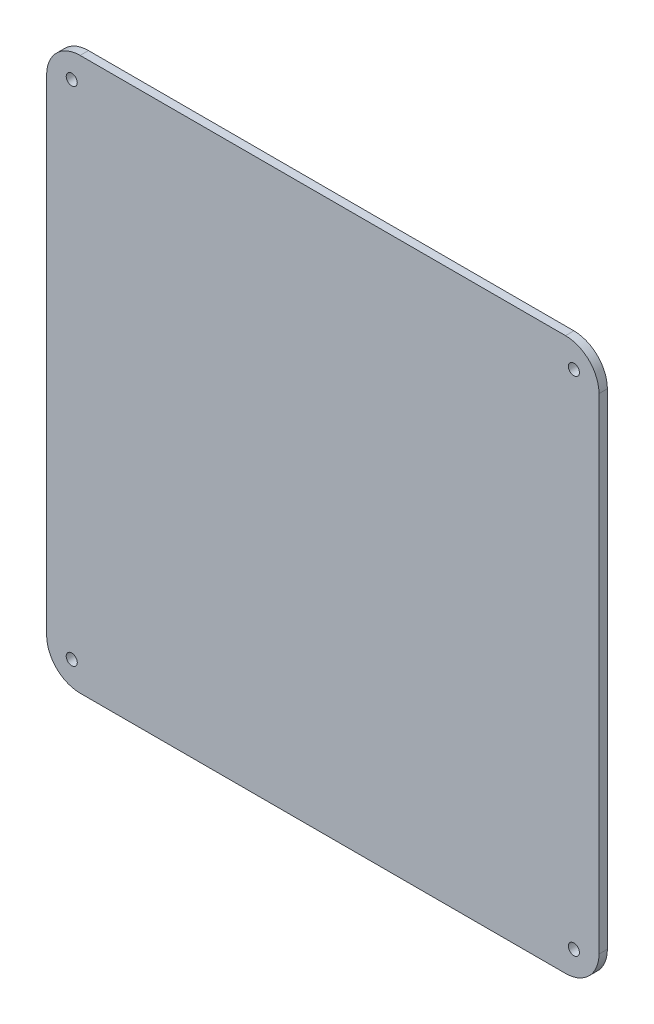
ISO-10303-21;
HEADER;
FILE_DESCRIPTION(('STEP AP214'),'2;1');
FILE_NAME('part.step','',(''),(''),'','','');
FILE_SCHEMA(('AUTOMOTIVE_DESIGN { 1 0 10303 214 1 1 1 1 }'));
ENDSEC;
DATA;
#1=APPLICATION_CONTEXT('core data for automotive mechanical design processes');
#2=APPLICATION_PROTOCOL_DEFINITION('international standard','automotive_design',2000,#1);
#3=PRODUCT_CONTEXT('',#1,'mechanical');
#4=PRODUCT('Part','Part','',(#3));
#5=PRODUCT_RELATED_PRODUCT_CATEGORY('part','',(#4));
#6=PRODUCT_DEFINITION_FORMATION('','',#4);
#7=PRODUCT_DEFINITION_CONTEXT('part definition',#1,'design');
#8=PRODUCT_DEFINITION('design','',#6,#7);
#9=PRODUCT_DEFINITION_SHAPE('','',#8);
#10=(LENGTH_UNIT() NAMED_UNIT(*) SI_UNIT(.MILLI.,.METRE.));
#11=(NAMED_UNIT(*) PLANE_ANGLE_UNIT() SI_UNIT($,.RADIAN.));
#12=(NAMED_UNIT(*) SI_UNIT($,.STERADIAN.) SOLID_ANGLE_UNIT());
#13=UNCERTAINTY_MEASURE_WITH_UNIT(LENGTH_MEASURE(1.E-05),#10,'distance_accuracy_value','');
#14=(GEOMETRIC_REPRESENTATION_CONTEXT(3) GLOBAL_UNCERTAINTY_ASSIGNED_CONTEXT((#13)) GLOBAL_UNIT_ASSIGNED_CONTEXT((#10,
#11,#12)) REPRESENTATION_CONTEXT('',''));
#15=CARTESIAN_POINT('',(0.,0.,0.));
#16=DIRECTION('',(0.,0.,1.));
#17=DIRECTION('',(1.,0.,0.));
#18=AXIS2_PLACEMENT_3D('',#15,#16,#17);
#19=CARTESIAN_POINT('',(-43.1287523486234,308.942488789238,5.));
#20=DIRECTION('',(1.,0.,0.));
#21=DIRECTION('',(0.,1.,0.));
#22=AXIS2_PLACEMENT_3D('',#19,#20,#21);
#23=PLANE('',#22);
#24=DIRECTION('',(0.,-1.,0.));
#25=VECTOR('',#24,1.);
#26=CARTESIAN_POINT('',(-43.1287523486234,308.942488789238,0.));
#27=LINE('',#26,#25);
#28=CARTESIAN_POINT('',(-43.1287523486234,288.942488789238,0.));
#29=VERTEX_POINT('',#28);
#30=CARTESIAN_POINT('',(-43.1287523486234,-1.05751121076236,0.));
#31=VERTEX_POINT('',#30);
#32=EDGE_CURVE('E184',#29,#31,#27,.T.);
#33=ORIENTED_EDGE('',*,*,#32,.T.);
#34=DIRECTION('',(0.,0.,-1.));
#35=VECTOR('',#34,1.);
#36=CARTESIAN_POINT('',(-43.1287523486234,-1.05751121076236,5.));
#37=LINE('',#36,#35);
#38=CARTESIAN_POINT('',(-43.1287523486234,-1.05751121076236,5.));
#39=VERTEX_POINT('',#38);
#40=EDGE_CURVE('E11',#31,#39,#37,.F.);
#41=ORIENTED_EDGE('',*,*,#40,.T.);
#42=DIRECTION('',(0.,-1.,0.));
#43=VECTOR('',#42,1.);
#44=CARTESIAN_POINT('',(-43.1287523486234,308.942488789238,5.));
#45=LINE('',#44,#43);
#46=CARTESIAN_POINT('',(-43.1287523486234,288.942488789238,5.));
#47=VERTEX_POINT('',#46);
#48=EDGE_CURVE('E136',#47,#39,#45,.T.);
#49=ORIENTED_EDGE('',*,*,#48,.F.);
#50=DIRECTION('',(0.,0.,-1.));
#51=VECTOR('',#50,1.);
#52=CARTESIAN_POINT('',(-43.1287523486234,288.942488789238,5.));
#53=LINE('',#52,#51);
#54=EDGE_CURVE('E49',#47,#29,#53,.T.);
#55=ORIENTED_EDGE('',*,*,#54,.T.);
#56=EDGE_LOOP('',(#33,#41,#49,#55));
#57=FACE_BOUND('',#56,.T.);
#58=ADVANCED_FACE('F40',(#57),#23,.F.);
#59=CARTESIAN_POINT('',(-43.1287523486234,-21.0575112107623,5.));
#60=DIRECTION('',(0.,1.,0.));
#61=DIRECTION('',(0.,0.,1.));
#62=AXIS2_PLACEMENT_3D('',#59,#60,#61);
#63=PLANE('',#62);
#64=DIRECTION('',(1.,0.,0.));
#65=VECTOR('',#64,1.);
#66=CARTESIAN_POINT('',(-43.1287523486234,-21.0575112107623,0.));
#67=LINE('',#66,#65);
#68=CARTESIAN_POINT('',(-23.1287523486234,-21.0575112107623,0.));
#69=VERTEX_POINT('',#68);
#70=CARTESIAN_POINT('',(266.871247651377,-21.0575112107623,0.));
#71=VERTEX_POINT('',#70);
#72=EDGE_CURVE('E144',#69,#71,#67,.T.);
#73=ORIENTED_EDGE('',*,*,#72,.T.);
#74=DIRECTION('',(0.,0.,-1.));
#75=VECTOR('',#74,1.);
#76=CARTESIAN_POINT('',(266.871247651377,-21.0575112107623,5.));
#77=LINE('',#76,#75);
#78=CARTESIAN_POINT('',(266.871247651377,-21.0575112107623,5.));
#79=VERTEX_POINT('',#78);
#80=EDGE_CURVE('E56',#71,#79,#77,.F.);
#81=ORIENTED_EDGE('',*,*,#80,.T.);
#82=DIRECTION('',(1.,0.,0.));
#83=VECTOR('',#82,1.);
#84=CARTESIAN_POINT('',(-43.1287523486234,-21.0575112107623,5.));
#85=LINE('',#84,#83);
#86=CARTESIAN_POINT('',(-23.1287523486234,-21.0575112107623,5.));
#87=VERTEX_POINT('',#86);
#88=EDGE_CURVE('E141',#87,#79,#85,.T.);
#89=ORIENTED_EDGE('',*,*,#88,.F.);
#90=DIRECTION('',(0.,0.,-1.));
#91=VECTOR('',#90,1.);
#92=CARTESIAN_POINT('',(-23.1287523486234,-21.0575112107623,5.));
#93=LINE('',#92,#91);
#94=EDGE_CURVE('E172',#87,#69,#93,.T.);
#95=ORIENTED_EDGE('',*,*,#94,.T.);
#96=EDGE_LOOP('',(#73,#81,#89,#95));
#97=FACE_BOUND('',#96,.T.);
#98=ADVANCED_FACE('F260',(#97),#63,.F.);
#99=CARTESIAN_POINT('',(286.871247651377,308.942488789238,5.));
#100=DIRECTION('',(-1.,0.,0.));
#101=DIRECTION('',(0.,-1.,0.));
#102=AXIS2_PLACEMENT_3D('',#99,#100,#101);
#103=PLANE('',#102);
#104=DIRECTION('',(0.,1.,0.));
#105=VECTOR('',#104,1.);
#106=CARTESIAN_POINT('',(286.871247651377,308.942488789238,0.));
#107=LINE('',#106,#105);
#108=CARTESIAN_POINT('',(286.871247651377,-1.05751121076236,0.));
#109=VERTEX_POINT('',#108);
#110=CARTESIAN_POINT('',(286.871247651377,288.942488789238,0.));
#111=VERTEX_POINT('',#110);
#112=EDGE_CURVE('E137',#109,#111,#107,.T.);
#113=ORIENTED_EDGE('',*,*,#112,.T.);
#114=DIRECTION('',(0.,0.,-1.));
#115=VECTOR('',#114,1.);
#116=CARTESIAN_POINT('',(286.871247651377,288.942488789238,5.));
#117=LINE('',#116,#115);
#118=CARTESIAN_POINT('',(286.871247651377,288.942488789238,5.));
#119=VERTEX_POINT('',#118);
#120=EDGE_CURVE('E112',#111,#119,#117,.F.);
#121=ORIENTED_EDGE('',*,*,#120,.T.);
#122=DIRECTION('',(0.,1.,0.));
#123=VECTOR('',#122,1.);
#124=CARTESIAN_POINT('',(286.871247651377,308.942488789238,5.));
#125=LINE('',#124,#123);
#126=CARTESIAN_POINT('',(286.871247651377,-1.05751121076236,5.));
#127=VERTEX_POINT('',#126);
#128=EDGE_CURVE('E199',#127,#119,#125,.T.);
#129=ORIENTED_EDGE('',*,*,#128,.F.);
#130=DIRECTION('',(0.,0.,-1.));
#131=VECTOR('',#130,1.);
#132=CARTESIAN_POINT('',(286.871247651377,-1.05751121076236,5.));
#133=LINE('',#132,#131);
#134=EDGE_CURVE('E118',#127,#109,#133,.T.);
#135=ORIENTED_EDGE('',*,*,#134,.T.);
#136=EDGE_LOOP('',(#113,#121,#129,#135));
#137=FACE_BOUND('',#136,.T.);
#138=ADVANCED_FACE('F265',(#137),#103,.F.);
#139=CARTESIAN_POINT('',(-43.1287523486234,308.942488789238,5.));
#140=DIRECTION('',(0.,-1.,0.));
#141=DIRECTION('',(0.,0.,-1.));
#142=AXIS2_PLACEMENT_3D('',#139,#140,#141);
#143=PLANE('',#142);
#144=DIRECTION('',(-1.,0.,0.));
#145=VECTOR('',#144,1.);
#146=CARTESIAN_POINT('',(-43.1287523486234,308.942488789238,5.));
#147=LINE('',#146,#145);
#148=CARTESIAN_POINT('',(266.871247651377,308.942488789238,5.));
#149=VERTEX_POINT('',#148);
#150=CARTESIAN_POINT('',(-23.1287523486234,308.942488789238,5.));
#151=VERTEX_POINT('',#150);
#152=EDGE_CURVE('E128',#149,#151,#147,.T.);
#153=ORIENTED_EDGE('',*,*,#152,.F.);
#154=DIRECTION('',(0.,0.,-1.));
#155=VECTOR('',#154,1.);
#156=CARTESIAN_POINT('',(266.871247651377,308.942488789238,5.));
#157=LINE('',#156,#155);
#158=CARTESIAN_POINT('',(266.871247651377,308.942488789238,0.));
#159=VERTEX_POINT('',#158);
#160=EDGE_CURVE('E111',#149,#159,#157,.T.);
#161=ORIENTED_EDGE('',*,*,#160,.T.);
#162=DIRECTION('',(-1.,0.,0.));
#163=VECTOR('',#162,1.);
#164=CARTESIAN_POINT('',(-43.1287523486234,308.942488789238,0.));
#165=LINE('',#164,#163);
#166=CARTESIAN_POINT('',(-23.1287523486234,308.942488789238,0.));
#167=VERTEX_POINT('',#166);
#168=EDGE_CURVE('E125',#159,#167,#165,.T.);
#169=ORIENTED_EDGE('',*,*,#168,.T.);
#170=DIRECTION('',(0.,0.,-1.));
#171=VECTOR('',#170,1.);
#172=CARTESIAN_POINT('',(-23.1287523486234,308.942488789238,5.));
#173=LINE('',#172,#171);
#174=EDGE_CURVE('E131',#167,#151,#173,.F.);
#175=ORIENTED_EDGE('',*,*,#174,.T.);
#176=EDGE_LOOP('',(#153,#161,#169,#175));
#177=FACE_BOUND('',#176,.T.);
#178=ADVANCED_FACE('F124',(#177),#143,.F.);
#179=CARTESIAN_POINT('',(-43.1287523486234,-21.0575112107623,5.));
#180=DIRECTION('',(0.,0.,1.));
#181=DIRECTION('',(1.,0.,0.));
#182=AXIS2_PLACEMENT_3D('',#179,#180,#181);
#183=PLANE('',#182);
#184=CARTESIAN_POINT('',(-28.1287523486233,293.942488789238,5.));
#185=DIRECTION('',(0.,0.,1.));
#186=DIRECTION('',(1.,0.,0.));
#187=AXIS2_PLACEMENT_3D('',#184,#185,#186);
#188=CIRCLE('',#187,3.3);
#189=CARTESIAN_POINT('',(-24.8287523486233,293.942488789238,5.));
#190=VERTEX_POINT('',#189);
#191=EDGE_CURVE('E224',#190,#190,#188,.T.);
#192=ORIENTED_EDGE('',*,*,#191,.F.);
#193=EDGE_LOOP('',(#192));
#194=FACE_BOUND('',#193,.T.);
#195=CARTESIAN_POINT('',(271.871247651377,293.942488789238,5.));
#196=DIRECTION('',(0.,0.,1.));
#197=DIRECTION('',(1.,0.,0.));
#198=AXIS2_PLACEMENT_3D('',#195,#196,#197);
#199=CIRCLE('',#198,3.30000000000004);
#200=CARTESIAN_POINT('',(275.171247651377,293.942488789238,5.));
#201=VERTEX_POINT('',#200);
#202=EDGE_CURVE('E216',#201,#201,#199,.T.);
#203=ORIENTED_EDGE('',*,*,#202,.F.);
#204=EDGE_LOOP('',(#203));
#205=FACE_BOUND('',#204,.T.);
#206=CARTESIAN_POINT('',(271.871247651377,-6.05751121076223,5.));
#207=DIRECTION('',(0.,0.,1.));
#208=DIRECTION('',(1.,0.,0.));
#209=AXIS2_PLACEMENT_3D('',#206,#207,#208);
#210=CIRCLE('',#209,3.30000000000003);
#211=CARTESIAN_POINT('',(275.171247651377,-6.05751121076223,5.));
#212=VERTEX_POINT('',#211);
#213=EDGE_CURVE('E208',#212,#212,#210,.T.);
#214=ORIENTED_EDGE('',*,*,#213,.F.);
#215=EDGE_LOOP('',(#214));
#216=FACE_BOUND('',#215,.T.);
#217=CARTESIAN_POINT('',(-28.1287523486233,-6.05751121076223,5.));
#218=DIRECTION('',(0.,0.,1.));
#219=DIRECTION('',(1.,0.,0.));
#220=AXIS2_PLACEMENT_3D('',#217,#218,#219);
#221=CIRCLE('',#220,3.3);
#222=CARTESIAN_POINT('',(-24.8287523486233,-6.05751121076223,5.));
#223=VERTEX_POINT('',#222);
#224=EDGE_CURVE('E190',#223,#223,#221,.T.);
#225=ORIENTED_EDGE('',*,*,#224,.F.);
#226=EDGE_LOOP('',(#225));
#227=FACE_BOUND('',#226,.T.);
#228=ORIENTED_EDGE('',*,*,#128,.T.);
#229=CARTESIAN_POINT('',(266.871247651377,288.942488789238,5.));
#230=DIRECTION('',(0.,0.,1.));
#231=DIRECTION('',(1.,0.,0.));
#232=AXIS2_PLACEMENT_3D('',#229,#230,#231);
#233=CIRCLE('',#232,20.);
#234=EDGE_CURVE('E169',#119,#149,#233,.T.);
#235=ORIENTED_EDGE('',*,*,#234,.T.);
#236=ORIENTED_EDGE('',*,*,#152,.T.);
#237=CARTESIAN_POINT('',(-23.1287523486234,288.942488789238,5.));
#238=DIRECTION('',(0.,0.,1.));
#239=DIRECTION('',(1.,0.,0.));
#240=AXIS2_PLACEMENT_3D('',#237,#238,#239);
#241=CIRCLE('',#240,20.);
#242=EDGE_CURVE('E161',#151,#47,#241,.T.);
#243=ORIENTED_EDGE('',*,*,#242,.T.);
#244=ORIENTED_EDGE('',*,*,#48,.T.);
#245=CARTESIAN_POINT('',(-23.1287523486234,-1.05751121076234,5.));
#246=DIRECTION('',(0.,0.,1.));
#247=DIRECTION('',(1.,0.,0.));
#248=AXIS2_PLACEMENT_3D('',#245,#246,#247);
#249=CIRCLE('',#248,20.);
#250=EDGE_CURVE('E63',#39,#87,#249,.T.);
#251=ORIENTED_EDGE('',*,*,#250,.T.);
#252=ORIENTED_EDGE('',*,*,#88,.T.);
#253=CARTESIAN_POINT('',(266.871247651377,-1.05751121076236,5.));
#254=DIRECTION('',(0.,0.,1.));
#255=DIRECTION('',(1.,0.,0.));
#256=AXIS2_PLACEMENT_3D('',#253,#254,#255);
#257=CIRCLE('',#256,20.);
#258=EDGE_CURVE('E166',#79,#127,#257,.T.);
#259=ORIENTED_EDGE('',*,*,#258,.T.);
#260=EDGE_LOOP('',(#228,#235,#236,#243,#244,#251,#252,#259));
#261=FACE_BOUND('',#260,.T.);
#262=ADVANCED_FACE('F237',(#194,#205,#216,#227,#261),#183,.T.);
#263=CARTESIAN_POINT('',(-43.1287523486234,-21.0575112107623,0.));
#264=DIRECTION('',(0.,0.,1.));
#265=DIRECTION('',(1.,0.,0.));
#266=AXIS2_PLACEMENT_3D('',#263,#264,#265);
#267=PLANE('',#266);
#268=CARTESIAN_POINT('',(-28.1287523486233,293.942488789238,0.));
#269=DIRECTION('',(0.,0.,-1.));
#270=DIRECTION('',(-1.,0.,0.));
#271=AXIS2_PLACEMENT_3D('',#268,#269,#270);
#272=CIRCLE('',#271,3.3);
#273=CARTESIAN_POINT('',(-31.4287523486233,293.942488789238,0.));
#274=VERTEX_POINT('',#273);
#275=EDGE_CURVE('E228',#274,#274,#272,.T.);
#276=ORIENTED_EDGE('',*,*,#275,.F.);
#277=EDGE_LOOP('',(#276));
#278=FACE_BOUND('',#277,.T.);
#279=CARTESIAN_POINT('',(271.871247651377,293.942488789238,0.));
#280=DIRECTION('',(0.,0.,-1.));
#281=DIRECTION('',(-1.,0.,0.));
#282=AXIS2_PLACEMENT_3D('',#279,#280,#281);
#283=CIRCLE('',#282,3.30000000000004);
#284=CARTESIAN_POINT('',(268.571247651377,293.942488789238,0.));
#285=VERTEX_POINT('',#284);
#286=EDGE_CURVE('E220',#285,#285,#283,.T.);
#287=ORIENTED_EDGE('',*,*,#286,.F.);
#288=EDGE_LOOP('',(#287));
#289=FACE_BOUND('',#288,.T.);
#290=CARTESIAN_POINT('',(271.871247651377,-6.05751121076223,0.));
#291=DIRECTION('',(0.,0.,-1.));
#292=DIRECTION('',(-1.,0.,0.));
#293=AXIS2_PLACEMENT_3D('',#290,#291,#292);
#294=CIRCLE('',#293,3.30000000000003);
#295=CARTESIAN_POINT('',(268.571247651377,-6.05751121076223,0.));
#296=VERTEX_POINT('',#295);
#297=EDGE_CURVE('E212',#296,#296,#294,.T.);
#298=ORIENTED_EDGE('',*,*,#297,.F.);
#299=EDGE_LOOP('',(#298));
#300=FACE_BOUND('',#299,.T.);
#301=CARTESIAN_POINT('',(-28.1287523486233,-6.05751121076223,0.));
#302=DIRECTION('',(0.,0.,-1.));
#303=DIRECTION('',(-1.,0.,0.));
#304=AXIS2_PLACEMENT_3D('',#301,#302,#303);
#305=CIRCLE('',#304,3.3);
#306=CARTESIAN_POINT('',(-31.4287523486233,-6.05751121076223,0.));
#307=VERTEX_POINT('',#306);
#308=EDGE_CURVE('E194',#307,#307,#305,.T.);
#309=ORIENTED_EDGE('',*,*,#308,.F.);
#310=EDGE_LOOP('',(#309));
#311=FACE_BOUND('',#310,.T.);
#312=ORIENTED_EDGE('',*,*,#168,.F.);
#313=CARTESIAN_POINT('',(266.871247651377,288.942488789238,0.));
#314=DIRECTION('',(0.,0.,1.));
#315=DIRECTION('',(1.,0.,0.));
#316=AXIS2_PLACEMENT_3D('',#313,#314,#315);
#317=CIRCLE('',#316,20.);
#318=EDGE_CURVE('E107',#159,#111,#317,.F.);
#319=ORIENTED_EDGE('',*,*,#318,.T.);
#320=ORIENTED_EDGE('',*,*,#112,.F.);
#321=CARTESIAN_POINT('',(266.871247651377,-1.05751121076236,0.));
#322=DIRECTION('',(0.,0.,1.));
#323=DIRECTION('',(1.,0.,0.));
#324=AXIS2_PLACEMENT_3D('',#321,#322,#323);
#325=CIRCLE('',#324,20.);
#326=EDGE_CURVE('E119',#109,#71,#325,.F.);
#327=ORIENTED_EDGE('',*,*,#326,.T.);
#328=ORIENTED_EDGE('',*,*,#72,.F.);
#329=CARTESIAN_POINT('',(-23.1287523486234,-1.05751121076234,0.));
#330=DIRECTION('',(0.,0.,1.));
#331=DIRECTION('',(1.,0.,0.));
#332=AXIS2_PLACEMENT_3D('',#329,#330,#331);
#333=CIRCLE('',#332,20.);
#334=EDGE_CURVE('E151',#69,#31,#333,.F.);
#335=ORIENTED_EDGE('',*,*,#334,.T.);
#336=ORIENTED_EDGE('',*,*,#32,.F.);
#337=CARTESIAN_POINT('',(-23.1287523486234,288.942488789238,0.));
#338=DIRECTION('',(0.,0.,1.));
#339=DIRECTION('',(1.,0.,0.));
#340=AXIS2_PLACEMENT_3D('',#337,#338,#339);
#341=CIRCLE('',#340,20.);
#342=EDGE_CURVE('E130',#29,#167,#341,.F.);
#343=ORIENTED_EDGE('',*,*,#342,.T.);
#344=EDGE_LOOP('',(#312,#319,#320,#327,#328,#335,#336,#343));
#345=FACE_BOUND('',#344,.T.);
#346=ADVANCED_FACE('F133',(#278,#289,#300,#311,#345),#267,.F.);
#347=CARTESIAN_POINT('',(266.871247651377,288.942488789238,5.));
#348=DIRECTION('',(0.,0.,-1.));
#349=DIRECTION('',(-1.,0.,0.));
#350=AXIS2_PLACEMENT_3D('',#347,#348,#349);
#351=CYLINDRICAL_SURFACE('',#350,20.);
#352=ORIENTED_EDGE('',*,*,#234,.F.);
#353=ORIENTED_EDGE('',*,*,#120,.F.);
#354=ORIENTED_EDGE('',*,*,#318,.F.);
#355=ORIENTED_EDGE('',*,*,#160,.F.);
#356=EDGE_LOOP('',(#352,#353,#354,#355));
#357=FACE_BOUND('',#356,.T.);
#358=ADVANCED_FACE('F110',(#357),#351,.T.);
#359=CARTESIAN_POINT('',(266.871247651377,-1.05751121076236,5.));
#360=DIRECTION('',(0.,0.,-1.));
#361=DIRECTION('',(-1.,0.,0.));
#362=AXIS2_PLACEMENT_3D('',#359,#360,#361);
#363=CYLINDRICAL_SURFACE('',#362,20.);
#364=ORIENTED_EDGE('',*,*,#258,.F.);
#365=ORIENTED_EDGE('',*,*,#80,.F.);
#366=ORIENTED_EDGE('',*,*,#326,.F.);
#367=ORIENTED_EDGE('',*,*,#134,.F.);
#368=EDGE_LOOP('',(#364,#365,#366,#367));
#369=FACE_BOUND('',#368,.T.);
#370=ADVANCED_FACE('F271',(#369),#363,.T.);
#371=CARTESIAN_POINT('',(-23.1287523486234,-1.05751121076234,5.));
#372=DIRECTION('',(0.,0.,-1.));
#373=DIRECTION('',(-1.,0.,0.));
#374=AXIS2_PLACEMENT_3D('',#371,#372,#373);
#375=CYLINDRICAL_SURFACE('',#374,20.);
#376=ORIENTED_EDGE('',*,*,#250,.F.);
#377=ORIENTED_EDGE('',*,*,#40,.F.);
#378=ORIENTED_EDGE('',*,*,#334,.F.);
#379=ORIENTED_EDGE('',*,*,#94,.F.);
#380=EDGE_LOOP('',(#376,#377,#378,#379));
#381=FACE_BOUND('',#380,.T.);
#382=ADVANCED_FACE('F257',(#381),#375,.T.);
#383=CARTESIAN_POINT('',(-23.1287523486234,288.942488789238,5.));
#384=DIRECTION('',(0.,0.,-1.));
#385=DIRECTION('',(-1.,0.,0.));
#386=AXIS2_PLACEMENT_3D('',#383,#384,#385);
#387=CYLINDRICAL_SURFACE('',#386,20.);
#388=ORIENTED_EDGE('',*,*,#242,.F.);
#389=ORIENTED_EDGE('',*,*,#174,.F.);
#390=ORIENTED_EDGE('',*,*,#342,.F.);
#391=ORIENTED_EDGE('',*,*,#54,.F.);
#392=EDGE_LOOP('',(#388,#389,#390,#391));
#393=FACE_BOUND('',#392,.T.);
#394=ADVANCED_FACE('F42',(#393),#387,.T.);
#395=CARTESIAN_POINT('',(-28.1287523486233,-6.05751121076223,10.));
#396=DIRECTION('',(0.,0.,-1.));
#397=DIRECTION('',(-1.,0.,0.));
#398=AXIS2_PLACEMENT_3D('',#395,#396,#397);
#399=CYLINDRICAL_SURFACE('',#398,3.3);
#400=ORIENTED_EDGE('',*,*,#224,.T.);
#401=EDGE_LOOP('',(#400));
#402=FACE_BOUND('',#401,.T.);
#403=ORIENTED_EDGE('',*,*,#308,.T.);
#404=EDGE_LOOP('',(#403));
#405=FACE_BOUND('',#404,.T.);
#406=ADVANCED_FACE('F245',(#402,#405),#399,.F.);
#407=CARTESIAN_POINT('',(271.871247651377,-6.05751121076223,10.));
#408=DIRECTION('',(0.,0.,-1.));
#409=DIRECTION('',(-1.,0.,0.));
#410=AXIS2_PLACEMENT_3D('',#407,#408,#409);
#411=CYLINDRICAL_SURFACE('',#410,3.30000000000003);
#412=ORIENTED_EDGE('',*,*,#213,.T.);
#413=EDGE_LOOP('',(#412));
#414=FACE_BOUND('',#413,.T.);
#415=ORIENTED_EDGE('',*,*,#297,.T.);
#416=EDGE_LOOP('',(#415));
#417=FACE_BOUND('',#416,.T.);
#418=ADVANCED_FACE('F247',(#414,#417),#411,.F.);
#419=CARTESIAN_POINT('',(271.871247651377,293.942488789238,10.));
#420=DIRECTION('',(0.,0.,-1.));
#421=DIRECTION('',(-1.,0.,0.));
#422=AXIS2_PLACEMENT_3D('',#419,#420,#421);
#423=CYLINDRICAL_SURFACE('',#422,3.30000000000004);
#424=ORIENTED_EDGE('',*,*,#202,.T.);
#425=EDGE_LOOP('',(#424));
#426=FACE_BOUND('',#425,.T.);
#427=ORIENTED_EDGE('',*,*,#286,.T.);
#428=EDGE_LOOP('',(#427));
#429=FACE_BOUND('',#428,.T.);
#430=ADVANCED_FACE('F254',(#426,#429),#423,.F.);
#431=CARTESIAN_POINT('',(-28.1287523486233,293.942488789238,10.));
#432=DIRECTION('',(0.,0.,-1.));
#433=DIRECTION('',(-1.,0.,0.));
#434=AXIS2_PLACEMENT_3D('',#431,#432,#433);
#435=CYLINDRICAL_SURFACE('',#434,3.3);
#436=ORIENTED_EDGE('',*,*,#191,.T.);
#437=EDGE_LOOP('',(#436));
#438=FACE_BOUND('',#437,.T.);
#439=ORIENTED_EDGE('',*,*,#275,.T.);
#440=EDGE_LOOP('',(#439));
#441=FACE_BOUND('',#440,.T.);
#442=ADVANCED_FACE('F233',(#438,#441),#435,.F.);
#443=CLOSED_SHELL('',(#58,#98,#138,#178,#262,#346,#358,#370,#382,#394,#406,#418,#430,#442));
#444=MANIFOLD_SOLID_BREP('B2',#443);
#445=ADVANCED_BREP_SHAPE_REPRESENTATION('',(#18,#444),#14);
#446=SHAPE_DEFINITION_REPRESENTATION(#9,#445);
ENDSEC;
END-ISO-10303-21;
